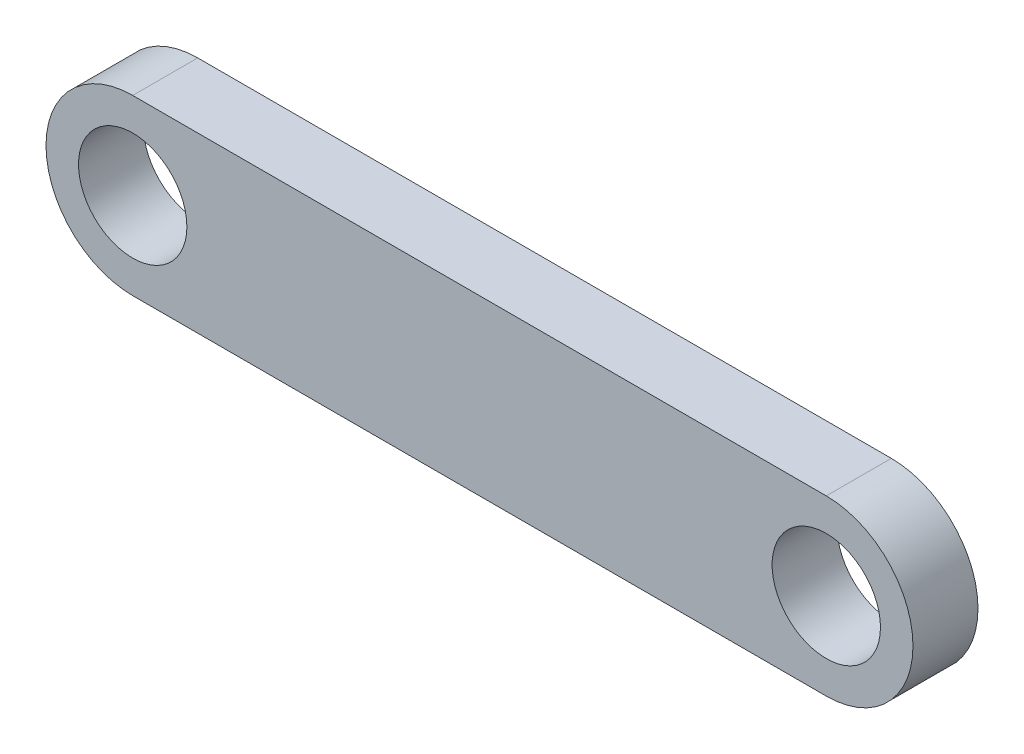
ISO-10303-21;
HEADER;
FILE_DESCRIPTION(('STEP AP214'),'2;1');
FILE_NAME('part.step','',(''),(''),'','','');
FILE_SCHEMA(('AUTOMOTIVE_DESIGN { 1 0 10303 214 1 1 1 1 }'));
ENDSEC;
DATA;
#1=APPLICATION_CONTEXT('core data for automotive mechanical design processes');
#2=APPLICATION_PROTOCOL_DEFINITION('international standard','automotive_design',2000,#1);
#3=PRODUCT_CONTEXT('',#1,'mechanical');
#4=PRODUCT('Part','Part','',(#3));
#5=PRODUCT_RELATED_PRODUCT_CATEGORY('part','',(#4));
#6=PRODUCT_DEFINITION_FORMATION('','',#4);
#7=PRODUCT_DEFINITION_CONTEXT('part definition',#1,'design');
#8=PRODUCT_DEFINITION('design','',#6,#7);
#9=PRODUCT_DEFINITION_SHAPE('','',#8);
#10=(LENGTH_UNIT() NAMED_UNIT(*) SI_UNIT(.MILLI.,.METRE.));
#11=(NAMED_UNIT(*) PLANE_ANGLE_UNIT() SI_UNIT($,.RADIAN.));
#12=(NAMED_UNIT(*) SI_UNIT($,.STERADIAN.) SOLID_ANGLE_UNIT());
#13=UNCERTAINTY_MEASURE_WITH_UNIT(LENGTH_MEASURE(1.E-05),#10,'distance_accuracy_value','');
#14=(GEOMETRIC_REPRESENTATION_CONTEXT(3) GLOBAL_UNCERTAINTY_ASSIGNED_CONTEXT((#13)) GLOBAL_UNIT_ASSIGNED_CONTEXT((#10,
#11,#12)) REPRESENTATION_CONTEXT('',''));
#15=CARTESIAN_POINT('',(0.,0.,0.));
#16=DIRECTION('',(0.,0.,1.));
#17=DIRECTION('',(1.,0.,0.));
#18=AXIS2_PLACEMENT_3D('',#15,#16,#17);
#19=CARTESIAN_POINT('',(0.,0.,3.));
#20=DIRECTION('',(0.,0.,1.));
#21=DIRECTION('',(1.,0.,0.));
#22=AXIS2_PLACEMENT_3D('',#19,#20,#21);
#23=PLANE('',#22);
#24=CARTESIAN_POINT('',(-32.,0.,3.));
#25=DIRECTION('',(0.,0.,1.));
#26=DIRECTION('',(1.,0.,0.));
#27=AXIS2_PLACEMENT_3D('',#24,#25,#26);
#28=CIRCLE('',#27,2.5);
#29=CARTESIAN_POINT('',(-29.5,0.,3.));
#30=VERTEX_POINT('',#29);
#31=EDGE_CURVE('E112',#30,#30,#28,.T.);
#32=ORIENTED_EDGE('',*,*,#31,.F.);
#33=EDGE_LOOP('',(#32));
#34=FACE_BOUND('',#33,.T.);
#35=CARTESIAN_POINT('',(0.,0.,3.));
#36=DIRECTION('',(0.,0.,1.));
#37=DIRECTION('',(1.,0.,0.));
#38=AXIS2_PLACEMENT_3D('',#35,#36,#37);
#39=CIRCLE('',#38,4.);
#40=CARTESIAN_POINT('',(0.,-4.,3.));
#41=VERTEX_POINT('',#40);
#42=CARTESIAN_POINT('',(0.,4.,3.));
#43=VERTEX_POINT('',#42);
#44=EDGE_CURVE('E92',#41,#43,#39,.T.);
#45=ORIENTED_EDGE('',*,*,#44,.T.);
#46=DIRECTION('',(-1.,0.,0.));
#47=VECTOR('',#46,1.);
#48=CARTESIAN_POINT('',(-32.,4.,3.));
#49=LINE('',#48,#47);
#50=CARTESIAN_POINT('',(-32.,4.,3.));
#51=VERTEX_POINT('',#50);
#52=EDGE_CURVE('E87',#43,#51,#49,.T.);
#53=ORIENTED_EDGE('',*,*,#52,.T.);
#54=CARTESIAN_POINT('',(-32.,0.,3.));
#55=DIRECTION('',(0.,0.,1.));
#56=DIRECTION('',(1.,0.,0.));
#57=AXIS2_PLACEMENT_3D('',#54,#55,#56);
#58=CIRCLE('',#57,4.);
#59=CARTESIAN_POINT('',(-32.,-4.,3.));
#60=VERTEX_POINT('',#59);
#61=EDGE_CURVE('E90',#51,#60,#58,.T.);
#62=ORIENTED_EDGE('',*,*,#61,.T.);
#63=DIRECTION('',(1.,0.,0.));
#64=VECTOR('',#63,1.);
#65=CARTESIAN_POINT('',(-32.,-4.,3.));
#66=LINE('',#65,#64);
#67=EDGE_CURVE('E57',#60,#41,#66,.T.);
#68=ORIENTED_EDGE('',*,*,#67,.T.);
#69=EDGE_LOOP('',(#45,#53,#62,#68));
#70=FACE_BOUND('',#69,.T.);
#71=CARTESIAN_POINT('',(0.,0.,3.));
#72=DIRECTION('',(0.,0.,1.));
#73=DIRECTION('',(1.,0.,0.));
#74=AXIS2_PLACEMENT_3D('',#71,#72,#73);
#75=CIRCLE('',#74,2.5);
#76=CARTESIAN_POINT('',(2.5,0.,3.));
#77=VERTEX_POINT('',#76);
#78=EDGE_CURVE('E134',#77,#77,#75,.T.);
#79=ORIENTED_EDGE('',*,*,#78,.F.);
#80=EDGE_LOOP('',(#79));
#81=FACE_BOUND('',#80,.T.);
#82=ADVANCED_FACE('F39',(#34,#70,#81),#23,.T.);
#83=CARTESIAN_POINT('',(0.,0.,0.));
#84=DIRECTION('',(0.,0.,1.));
#85=DIRECTION('',(1.,0.,0.));
#86=AXIS2_PLACEMENT_3D('',#83,#84,#85);
#87=PLANE('',#86);
#88=CARTESIAN_POINT('',(0.,0.,0.));
#89=DIRECTION('',(0.,0.,1.));
#90=DIRECTION('',(1.,0.,0.));
#91=AXIS2_PLACEMENT_3D('',#88,#89,#90);
#92=CIRCLE('',#91,4.);
#93=CARTESIAN_POINT('',(0.,-4.,0.));
#94=VERTEX_POINT('',#93);
#95=CARTESIAN_POINT('',(0.,4.,0.));
#96=VERTEX_POINT('',#95);
#97=EDGE_CURVE('E108',#94,#96,#92,.T.);
#98=ORIENTED_EDGE('',*,*,#97,.F.);
#99=DIRECTION('',(1.,0.,0.));
#100=VECTOR('',#99,1.);
#101=CARTESIAN_POINT('',(-32.,-4.,0.));
#102=LINE('',#101,#100);
#103=CARTESIAN_POINT('',(-32.,-4.,0.));
#104=VERTEX_POINT('',#103);
#105=EDGE_CURVE('E80',#104,#94,#102,.T.);
#106=ORIENTED_EDGE('',*,*,#105,.F.);
#107=CARTESIAN_POINT('',(-32.,0.,0.));
#108=DIRECTION('',(0.,0.,1.));
#109=DIRECTION('',(1.,0.,0.));
#110=AXIS2_PLACEMENT_3D('',#107,#108,#109);
#111=CIRCLE('',#110,4.);
#112=CARTESIAN_POINT('',(-32.,4.,0.));
#113=VERTEX_POINT('',#112);
#114=EDGE_CURVE('E74',#113,#104,#111,.T.);
#115=ORIENTED_EDGE('',*,*,#114,.F.);
#116=DIRECTION('',(-1.,0.,0.));
#117=VECTOR('',#116,1.);
#118=CARTESIAN_POINT('',(-32.,4.,0.));
#119=LINE('',#118,#117);
#120=EDGE_CURVE('E97',#96,#113,#119,.T.);
#121=ORIENTED_EDGE('',*,*,#120,.F.);
#122=EDGE_LOOP('',(#98,#106,#115,#121));
#123=FACE_BOUND('',#122,.T.);
#124=CARTESIAN_POINT('',(-32.,0.,0.));
#125=DIRECTION('',(0.,0.,1.));
#126=DIRECTION('',(1.,0.,0.));
#127=AXIS2_PLACEMENT_3D('',#124,#125,#126);
#128=CIRCLE('',#127,2.5);
#129=CARTESIAN_POINT('',(-29.5,0.,0.));
#130=VERTEX_POINT('',#129);
#131=EDGE_CURVE('E130',#130,#130,#128,.T.);
#132=ORIENTED_EDGE('',*,*,#131,.T.);
#133=EDGE_LOOP('',(#132));
#134=FACE_BOUND('',#133,.T.);
#135=CARTESIAN_POINT('',(0.,0.,0.));
#136=DIRECTION('',(0.,0.,1.));
#137=DIRECTION('',(1.,0.,0.));
#138=AXIS2_PLACEMENT_3D('',#135,#136,#137);
#139=CIRCLE('',#138,2.5);
#140=CARTESIAN_POINT('',(2.5,0.,0.));
#141=VERTEX_POINT('',#140);
#142=EDGE_CURVE('E138',#141,#141,#139,.T.);
#143=ORIENTED_EDGE('',*,*,#142,.T.);
#144=EDGE_LOOP('',(#143));
#145=FACE_BOUND('',#144,.T.);
#146=ADVANCED_FACE('F125',(#123,#134,#145),#87,.F.);
#147=CARTESIAN_POINT('',(0.,0.,3.));
#148=DIRECTION('',(0.,0.,-1.));
#149=DIRECTION('',(-1.,0.,0.));
#150=AXIS2_PLACEMENT_3D('',#147,#148,#149);
#151=CYLINDRICAL_SURFACE('',#150,4.);
#152=ORIENTED_EDGE('',*,*,#97,.T.);
#153=DIRECTION('',(0.,0.,-1.));
#154=VECTOR('',#153,1.);
#155=CARTESIAN_POINT('',(0.,4.,3.));
#156=LINE('',#155,#154);
#157=EDGE_CURVE('E11',#43,#96,#156,.T.);
#158=ORIENTED_EDGE('',*,*,#157,.F.);
#159=ORIENTED_EDGE('',*,*,#44,.F.);
#160=DIRECTION('',(0.,0.,-1.));
#161=VECTOR('',#160,1.);
#162=CARTESIAN_POINT('',(0.,-4.,3.));
#163=LINE('',#162,#161);
#164=EDGE_CURVE('E104',#41,#94,#163,.T.);
#165=ORIENTED_EDGE('',*,*,#164,.T.);
#166=EDGE_LOOP('',(#152,#158,#159,#165));
#167=FACE_BOUND('',#166,.T.);
#168=ADVANCED_FACE('F41',(#167),#151,.T.);
#169=CARTESIAN_POINT('',(-32.,4.,3.));
#170=DIRECTION('',(0.,-1.,0.));
#171=DIRECTION('',(1.,0.,0.));
#172=AXIS2_PLACEMENT_3D('',#169,#170,#171);
#173=PLANE('',#172);
#174=ORIENTED_EDGE('',*,*,#120,.T.);
#175=DIRECTION('',(0.,0.,-1.));
#176=VECTOR('',#175,1.);
#177=CARTESIAN_POINT('',(-32.,4.,3.));
#178=LINE('',#177,#176);
#179=EDGE_CURVE('E49',#51,#113,#178,.T.);
#180=ORIENTED_EDGE('',*,*,#179,.F.);
#181=ORIENTED_EDGE('',*,*,#52,.F.);
#182=ORIENTED_EDGE('',*,*,#157,.T.);
#183=EDGE_LOOP('',(#174,#180,#181,#182));
#184=FACE_BOUND('',#183,.T.);
#185=ADVANCED_FACE('F96',(#184),#173,.F.);
#186=CARTESIAN_POINT('',(-32.,0.,3.));
#187=DIRECTION('',(0.,0.,-1.));
#188=DIRECTION('',(-1.,0.,0.));
#189=AXIS2_PLACEMENT_3D('',#186,#187,#188);
#190=CYLINDRICAL_SURFACE('',#189,4.);
#191=ORIENTED_EDGE('',*,*,#114,.T.);
#192=DIRECTION('',(0.,0.,-1.));
#193=VECTOR('',#192,1.);
#194=CARTESIAN_POINT('',(-32.,-4.,3.));
#195=LINE('',#194,#193);
#196=EDGE_CURVE('E99',#60,#104,#195,.T.);
#197=ORIENTED_EDGE('',*,*,#196,.F.);
#198=ORIENTED_EDGE('',*,*,#61,.F.);
#199=ORIENTED_EDGE('',*,*,#179,.T.);
#200=EDGE_LOOP('',(#191,#197,#198,#199));
#201=FACE_BOUND('',#200,.T.);
#202=ADVANCED_FACE('F100',(#201),#190,.T.);
#203=CARTESIAN_POINT('',(-32.,-4.,3.));
#204=DIRECTION('',(0.,1.,0.));
#205=DIRECTION('',(-1.,0.,0.));
#206=AXIS2_PLACEMENT_3D('',#203,#204,#205);
#207=PLANE('',#206);
#208=ORIENTED_EDGE('',*,*,#105,.T.);
#209=ORIENTED_EDGE('',*,*,#164,.F.);
#210=ORIENTED_EDGE('',*,*,#67,.F.);
#211=ORIENTED_EDGE('',*,*,#196,.T.);
#212=EDGE_LOOP('',(#208,#209,#210,#211));
#213=FACE_BOUND('',#212,.T.);
#214=ADVANCED_FACE('F122',(#213),#207,.F.);
#215=CARTESIAN_POINT('',(-32.,0.,3.));
#216=DIRECTION('',(0.,0.,-1.));
#217=DIRECTION('',(-1.,0.,0.));
#218=AXIS2_PLACEMENT_3D('',#215,#216,#217);
#219=CYLINDRICAL_SURFACE('',#218,2.5);
#220=ORIENTED_EDGE('',*,*,#31,.T.);
#221=EDGE_LOOP('',(#220));
#222=FACE_BOUND('',#221,.T.);
#223=ORIENTED_EDGE('',*,*,#131,.F.);
#224=EDGE_LOOP('',(#223));
#225=FACE_BOUND('',#224,.T.);
#226=ADVANCED_FACE('F157',(#222,#225),#219,.F.);
#227=CARTESIAN_POINT('',(0.,0.,3.));
#228=DIRECTION('',(0.,0.,-1.));
#229=DIRECTION('',(-1.,0.,0.));
#230=AXIS2_PLACEMENT_3D('',#227,#228,#229);
#231=CYLINDRICAL_SURFACE('',#230,2.5);
#232=ORIENTED_EDGE('',*,*,#78,.T.);
#233=EDGE_LOOP('',(#232));
#234=FACE_BOUND('',#233,.T.);
#235=ORIENTED_EDGE('',*,*,#142,.F.);
#236=EDGE_LOOP('',(#235));
#237=FACE_BOUND('',#236,.T.);
#238=ADVANCED_FACE('F146',(#234,#237),#231,.F.);
#239=CLOSED_SHELL('',(#82,#146,#168,#185,#202,#214,#226,#238));
#240=MANIFOLD_SOLID_BREP('B2',#239);
#241=ADVANCED_BREP_SHAPE_REPRESENTATION('',(#18,#240),#14);
#242=SHAPE_DEFINITION_REPRESENTATION(#9,#241);
ENDSEC;
END-ISO-10303-21;
